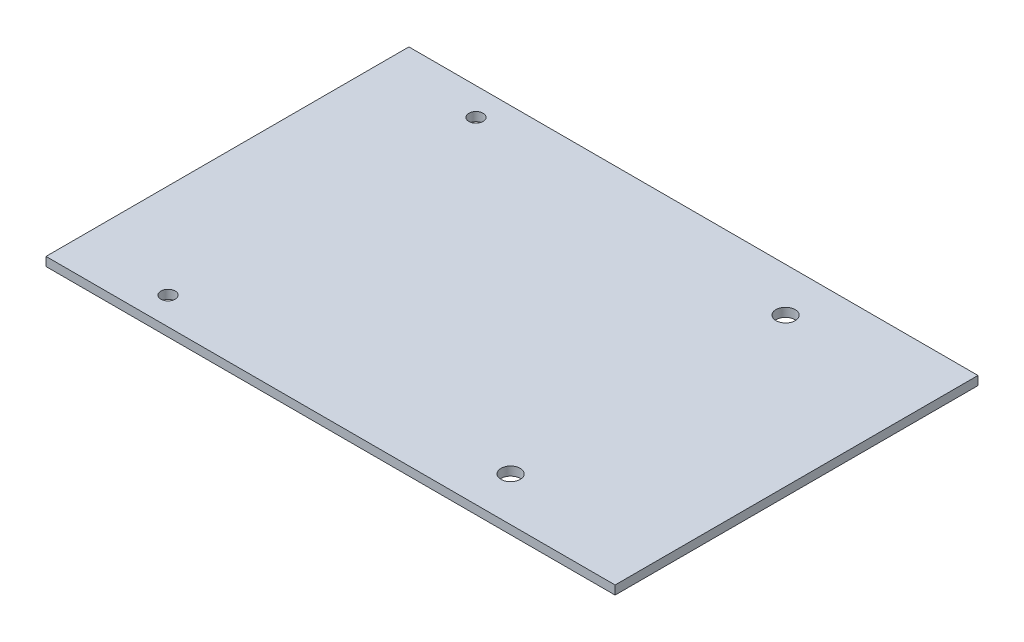
ISO-10303-21;
HEADER;
FILE_DESCRIPTION(('STEP AP214'),'2;1');
FILE_NAME('part.step','',(''),(''),'','','');
FILE_SCHEMA(('AUTOMOTIVE_DESIGN { 1 0 10303 214 1 1 1 1 }'));
ENDSEC;
DATA;
#1=APPLICATION_CONTEXT('core data for automotive mechanical design processes');
#2=APPLICATION_PROTOCOL_DEFINITION('international standard','automotive_design',2000,#1);
#3=PRODUCT_CONTEXT('',#1,'mechanical');
#4=PRODUCT('Part','Part','',(#3));
#5=PRODUCT_RELATED_PRODUCT_CATEGORY('part','',(#4));
#6=PRODUCT_DEFINITION_FORMATION('','',#4);
#7=PRODUCT_DEFINITION_CONTEXT('part definition',#1,'design');
#8=PRODUCT_DEFINITION('design','',#6,#7);
#9=PRODUCT_DEFINITION_SHAPE('','',#8);
#10=(LENGTH_UNIT() NAMED_UNIT(*) SI_UNIT(.MILLI.,.METRE.));
#11=(NAMED_UNIT(*) PLANE_ANGLE_UNIT() SI_UNIT($,.RADIAN.));
#12=(NAMED_UNIT(*) SI_UNIT($,.STERADIAN.) SOLID_ANGLE_UNIT());
#13=UNCERTAINTY_MEASURE_WITH_UNIT(LENGTH_MEASURE(1.E-05),#10,'distance_accuracy_value','');
#14=(GEOMETRIC_REPRESENTATION_CONTEXT(3) GLOBAL_UNCERTAINTY_ASSIGNED_CONTEXT((#13)) GLOBAL_UNIT_ASSIGNED_CONTEXT((#10,
#11,#12)) REPRESENTATION_CONTEXT('',''));
#15=CARTESIAN_POINT('',(0.,0.,0.));
#16=DIRECTION('',(0.,0.,1.));
#17=DIRECTION('',(1.,0.,0.));
#18=AXIS2_PLACEMENT_3D('',#15,#16,#17);
#19=CARTESIAN_POINT('',(51.75,1.6,33.));
#20=DIRECTION('',(-1.,0.,0.));
#21=DIRECTION('',(0.,0.,1.));
#22=AXIS2_PLACEMENT_3D('',#19,#20,#21);
#23=PLANE('',#22);
#24=DIRECTION('',(0.,0.,-1.));
#25=VECTOR('',#24,1.);
#26=CARTESIAN_POINT('',(51.75,0.,33.));
#27=LINE('',#26,#25);
#28=CARTESIAN_POINT('',(51.75,0.,33.));
#29=VERTEX_POINT('',#28);
#30=CARTESIAN_POINT('',(51.75,0.,-33.));
#31=VERTEX_POINT('',#30);
#32=EDGE_CURVE('E97',#29,#31,#27,.T.);
#33=ORIENTED_EDGE('',*,*,#32,.T.);
#34=DIRECTION('',(0.,-1.,0.));
#35=VECTOR('',#34,1.);
#36=CARTESIAN_POINT('',(51.75,1.6,-33.));
#37=LINE('',#36,#35);
#38=CARTESIAN_POINT('',(51.75,1.6,-33.));
#39=VERTEX_POINT('',#38);
#40=EDGE_CURVE('E11',#39,#31,#37,.T.);
#41=ORIENTED_EDGE('',*,*,#40,.F.);
#42=DIRECTION('',(0.,0.,-1.));
#43=VECTOR('',#42,1.);
#44=CARTESIAN_POINT('',(51.75,1.6,33.));
#45=LINE('',#44,#43);
#46=CARTESIAN_POINT('',(51.75,1.6,33.));
#47=VERTEX_POINT('',#46);
#48=EDGE_CURVE('E84',#47,#39,#45,.T.);
#49=ORIENTED_EDGE('',*,*,#48,.F.);
#50=DIRECTION('',(0.,-1.,0.));
#51=VECTOR('',#50,1.);
#52=CARTESIAN_POINT('',(51.75,1.6,33.));
#53=LINE('',#52,#51);
#54=EDGE_CURVE('E93',#47,#29,#53,.T.);
#55=ORIENTED_EDGE('',*,*,#54,.T.);
#56=EDGE_LOOP('',(#33,#41,#49,#55));
#57=FACE_BOUND('',#56,.T.);
#58=ADVANCED_FACE('F31',(#57),#23,.F.);
#59=CARTESIAN_POINT('',(-51.75,1.6,-33.));
#60=DIRECTION('',(0.,0.,1.));
#61=DIRECTION('',(1.,0.,0.));
#62=AXIS2_PLACEMENT_3D('',#59,#60,#61);
#63=PLANE('',#62);
#64=DIRECTION('',(-1.,0.,0.));
#65=VECTOR('',#64,1.);
#66=CARTESIAN_POINT('',(-51.75,0.,-33.));
#67=LINE('',#66,#65);
#68=CARTESIAN_POINT('',(-51.75,0.,-33.));
#69=VERTEX_POINT('',#68);
#70=EDGE_CURVE('E88',#31,#69,#67,.T.);
#71=ORIENTED_EDGE('',*,*,#70,.T.);
#72=DIRECTION('',(0.,-1.,0.));
#73=VECTOR('',#72,1.);
#74=CARTESIAN_POINT('',(-51.75,1.6,-33.));
#75=LINE('',#74,#73);
#76=CARTESIAN_POINT('',(-51.75,1.6,-33.));
#77=VERTEX_POINT('',#76);
#78=EDGE_CURVE('E40',#77,#69,#75,.T.);
#79=ORIENTED_EDGE('',*,*,#78,.F.);
#80=DIRECTION('',(-1.,0.,0.));
#81=VECTOR('',#80,1.);
#82=CARTESIAN_POINT('',(-51.75,1.6,-33.));
#83=LINE('',#82,#81);
#84=EDGE_CURVE('E79',#39,#77,#83,.T.);
#85=ORIENTED_EDGE('',*,*,#84,.F.);
#86=ORIENTED_EDGE('',*,*,#40,.T.);
#87=EDGE_LOOP('',(#71,#79,#85,#86));
#88=FACE_BOUND('',#87,.T.);
#89=ADVANCED_FACE('F87',(#88),#63,.F.);
#90=CARTESIAN_POINT('',(-51.75,1.6,33.));
#91=DIRECTION('',(1.,0.,0.));
#92=DIRECTION('',(0.,0.,-1.));
#93=AXIS2_PLACEMENT_3D('',#90,#91,#92);
#94=PLANE('',#93);
#95=DIRECTION('',(0.,0.,1.));
#96=VECTOR('',#95,1.);
#97=CARTESIAN_POINT('',(-51.75,0.,33.));
#98=LINE('',#97,#96);
#99=CARTESIAN_POINT('',(-51.75,0.,33.));
#100=VERTEX_POINT('',#99);
#101=EDGE_CURVE('E66',#69,#100,#98,.T.);
#102=ORIENTED_EDGE('',*,*,#101,.T.);
#103=DIRECTION('',(0.,-1.,0.));
#104=VECTOR('',#103,1.);
#105=CARTESIAN_POINT('',(-51.75,1.6,33.));
#106=LINE('',#105,#104);
#107=CARTESIAN_POINT('',(-51.75,1.6,33.));
#108=VERTEX_POINT('',#107);
#109=EDGE_CURVE('E89',#108,#100,#106,.T.);
#110=ORIENTED_EDGE('',*,*,#109,.F.);
#111=DIRECTION('',(0.,0.,1.));
#112=VECTOR('',#111,1.);
#113=CARTESIAN_POINT('',(-51.75,1.6,33.));
#114=LINE('',#113,#112);
#115=EDGE_CURVE('E82',#77,#108,#114,.T.);
#116=ORIENTED_EDGE('',*,*,#115,.F.);
#117=ORIENTED_EDGE('',*,*,#78,.T.);
#118=EDGE_LOOP('',(#102,#110,#116,#117));
#119=FACE_BOUND('',#118,.T.);
#120=ADVANCED_FACE('F91',(#119),#94,.F.);
#121=CARTESIAN_POINT('',(-51.75,1.6,33.));
#122=DIRECTION('',(0.,0.,-1.));
#123=DIRECTION('',(-1.,0.,0.));
#124=AXIS2_PLACEMENT_3D('',#121,#122,#123);
#125=PLANE('',#124);
#126=DIRECTION('',(1.,0.,0.));
#127=VECTOR('',#126,1.);
#128=CARTESIAN_POINT('',(-51.75,0.,33.));
#129=LINE('',#128,#127);
#130=EDGE_CURVE('E72',#100,#29,#129,.T.);
#131=ORIENTED_EDGE('',*,*,#130,.T.);
#132=ORIENTED_EDGE('',*,*,#54,.F.);
#133=DIRECTION('',(1.,0.,0.));
#134=VECTOR('',#133,1.);
#135=CARTESIAN_POINT('',(-51.75,1.6,33.));
#136=LINE('',#135,#134);
#137=EDGE_CURVE('E49',#108,#47,#136,.T.);
#138=ORIENTED_EDGE('',*,*,#137,.F.);
#139=ORIENTED_EDGE('',*,*,#109,.T.);
#140=EDGE_LOOP('',(#131,#132,#138,#139));
#141=FACE_BOUND('',#140,.T.);
#142=ADVANCED_FACE('F136',(#141),#125,.F.);
#143=CARTESIAN_POINT('',(51.75,1.6,-33.));
#144=DIRECTION('',(0.,-1.,0.));
#145=DIRECTION('',(0.,0.,-1.));
#146=AXIS2_PLACEMENT_3D('',#143,#144,#145);
#147=PLANE('',#146);
#148=CARTESIAN_POINT('',(24.75,1.6,25.));
#149=DIRECTION('',(0.,1.,0.));
#150=DIRECTION('',(0.,0.,1.));
#151=AXIS2_PLACEMENT_3D('',#148,#149,#150);
#152=CIRCLE('',#151,1.75);
#153=CARTESIAN_POINT('',(24.75,1.6,26.75));
#154=VERTEX_POINT('',#153);
#155=EDGE_CURVE('E122',#154,#154,#152,.T.);
#156=ORIENTED_EDGE('',*,*,#155,.F.);
#157=EDGE_LOOP('',(#156));
#158=FACE_BOUND('',#157,.T.);
#159=CARTESIAN_POINT('',(24.75,1.6,-25.));
#160=DIRECTION('',(0.,1.,0.));
#161=DIRECTION('',(0.,0.,1.));
#162=AXIS2_PLACEMENT_3D('',#159,#160,#161);
#163=CIRCLE('',#162,1.75);
#164=CARTESIAN_POINT('',(24.75,1.6,-23.25));
#165=VERTEX_POINT('',#164);
#166=EDGE_CURVE('E118',#165,#165,#163,.T.);
#167=ORIENTED_EDGE('',*,*,#166,.F.);
#168=EDGE_LOOP('',(#167));
#169=FACE_BOUND('',#168,.T.);
#170=CARTESIAN_POINT('',(-34.552335,1.6,28.));
#171=DIRECTION('',(0.,1.,0.));
#172=DIRECTION('',(0.,0.,1.));
#173=AXIS2_PLACEMENT_3D('',#170,#171,#172);
#174=CIRCLE('',#173,1.3);
#175=CARTESIAN_POINT('',(-34.552335,1.6,29.3));
#176=VERTEX_POINT('',#175);
#177=EDGE_CURVE('E114',#176,#176,#174,.T.);
#178=ORIENTED_EDGE('',*,*,#177,.F.);
#179=EDGE_LOOP('',(#178));
#180=FACE_BOUND('',#179,.T.);
#181=CARTESIAN_POINT('',(-34.552335,1.6,-28.));
#182=DIRECTION('',(0.,1.,0.));
#183=DIRECTION('',(0.,0.,1.));
#184=AXIS2_PLACEMENT_3D('',#181,#182,#183);
#185=CIRCLE('',#184,1.3);
#186=CARTESIAN_POINT('',(-34.552335,1.6,-26.7));
#187=VERTEX_POINT('',#186);
#188=EDGE_CURVE('E106',#187,#187,#185,.T.);
#189=ORIENTED_EDGE('',*,*,#188,.F.);
#190=EDGE_LOOP('',(#189));
#191=FACE_BOUND('',#190,.T.);
#192=ORIENTED_EDGE('',*,*,#48,.T.);
#193=ORIENTED_EDGE('',*,*,#84,.T.);
#194=ORIENTED_EDGE('',*,*,#115,.T.);
#195=ORIENTED_EDGE('',*,*,#137,.T.);
#196=EDGE_LOOP('',(#192,#193,#194,#195));
#197=FACE_BOUND('',#196,.T.);
#198=ADVANCED_FACE('F80',(#158,#169,#180,#191,#197),#147,.F.);
#199=CARTESIAN_POINT('',(51.75,0.,-33.));
#200=DIRECTION('',(0.,-1.,0.));
#201=DIRECTION('',(0.,0.,-1.));
#202=AXIS2_PLACEMENT_3D('',#199,#200,#201);
#203=PLANE('',#202);
#204=CARTESIAN_POINT('',(24.75,0.,25.));
#205=DIRECTION('',(0.,-1.,0.));
#206=DIRECTION('',(0.,0.,-1.));
#207=AXIS2_PLACEMENT_3D('',#204,#205,#206);
#208=CIRCLE('',#207,1.75);
#209=CARTESIAN_POINT('',(24.75,0.,23.25));
#210=VERTEX_POINT('',#209);
#211=EDGE_CURVE('E125',#210,#210,#208,.F.);
#212=ORIENTED_EDGE('',*,*,#211,.T.);
#213=EDGE_LOOP('',(#212));
#214=FACE_BOUND('',#213,.T.);
#215=CARTESIAN_POINT('',(24.75,0.,-25.));
#216=DIRECTION('',(0.,-1.,0.));
#217=DIRECTION('',(0.,0.,-1.));
#218=AXIS2_PLACEMENT_3D('',#215,#216,#217);
#219=CIRCLE('',#218,1.75);
#220=CARTESIAN_POINT('',(24.75,0.,-26.75));
#221=VERTEX_POINT('',#220);
#222=EDGE_CURVE('E119',#221,#221,#219,.F.);
#223=ORIENTED_EDGE('',*,*,#222,.T.);
#224=EDGE_LOOP('',(#223));
#225=FACE_BOUND('',#224,.T.);
#226=CARTESIAN_POINT('',(-34.552335,0.,28.));
#227=DIRECTION('',(0.,-1.,0.));
#228=DIRECTION('',(0.,0.,-1.));
#229=AXIS2_PLACEMENT_3D('',#226,#227,#228);
#230=CIRCLE('',#229,1.3);
#231=CARTESIAN_POINT('',(-34.552335,0.,26.7));
#232=VERTEX_POINT('',#231);
#233=EDGE_CURVE('E34',#232,#232,#230,.T.);
#234=ORIENTED_EDGE('',*,*,#233,.F.);
#235=EDGE_LOOP('',(#234));
#236=FACE_BOUND('',#235,.T.);
#237=CARTESIAN_POINT('',(-34.552335,0.,-28.));
#238=DIRECTION('',(0.,-1.,0.));
#239=DIRECTION('',(0.,0.,-1.));
#240=AXIS2_PLACEMENT_3D('',#237,#238,#239);
#241=CIRCLE('',#240,1.3);
#242=CARTESIAN_POINT('',(-34.552335,0.,-29.3));
#243=VERTEX_POINT('',#242);
#244=EDGE_CURVE('E100',#243,#243,#241,.T.);
#245=ORIENTED_EDGE('',*,*,#244,.F.);
#246=EDGE_LOOP('',(#245));
#247=FACE_BOUND('',#246,.T.);
#248=ORIENTED_EDGE('',*,*,#32,.F.);
#249=ORIENTED_EDGE('',*,*,#130,.F.);
#250=ORIENTED_EDGE('',*,*,#101,.F.);
#251=ORIENTED_EDGE('',*,*,#70,.F.);
#252=EDGE_LOOP('',(#248,#249,#250,#251));
#253=FACE_BOUND('',#252,.T.);
#254=ADVANCED_FACE('F135',(#214,#225,#236,#247,#253),#203,.T.);
#255=CARTESIAN_POINT('',(-34.552335,-8.4,-28.));
#256=DIRECTION('',(0.,1.,0.));
#257=DIRECTION('',(0.,0.,1.));
#258=AXIS2_PLACEMENT_3D('',#255,#256,#257);
#259=CYLINDRICAL_SURFACE('',#258,1.3);
#260=ORIENTED_EDGE('',*,*,#244,.T.);
#261=EDGE_LOOP('',(#260));
#262=FACE_BOUND('',#261,.T.);
#263=ORIENTED_EDGE('',*,*,#188,.T.);
#264=EDGE_LOOP('',(#263));
#265=FACE_BOUND('',#264,.T.);
#266=ADVANCED_FACE('F146',(#262,#265),#259,.F.);
#267=CARTESIAN_POINT('',(-34.552335,-8.4,28.));
#268=DIRECTION('',(0.,1.,0.));
#269=DIRECTION('',(0.,0.,1.));
#270=AXIS2_PLACEMENT_3D('',#267,#268,#269);
#271=CYLINDRICAL_SURFACE('',#270,1.3);
#272=ORIENTED_EDGE('',*,*,#233,.T.);
#273=EDGE_LOOP('',(#272));
#274=FACE_BOUND('',#273,.T.);
#275=ORIENTED_EDGE('',*,*,#177,.T.);
#276=EDGE_LOOP('',(#275));
#277=FACE_BOUND('',#276,.T.);
#278=ADVANCED_FACE('F143',(#274,#277),#271,.F.);
#279=CARTESIAN_POINT('',(24.75,-0.000999999999999916,-25.));
#280=DIRECTION('',(0.,1.,0.));
#281=DIRECTION('',(0.,0.,1.));
#282=AXIS2_PLACEMENT_3D('',#279,#280,#281);
#283=CYLINDRICAL_SURFACE('',#282,1.75);
#284=ORIENTED_EDGE('',*,*,#222,.F.);
#285=EDGE_LOOP('',(#284));
#286=FACE_BOUND('',#285,.T.);
#287=ORIENTED_EDGE('',*,*,#166,.T.);
#288=EDGE_LOOP('',(#287));
#289=FACE_BOUND('',#288,.T.);
#290=ADVANCED_FACE('F145',(#286,#289),#283,.F.);
#291=CARTESIAN_POINT('',(24.75,-0.000999999999999916,25.));
#292=DIRECTION('',(0.,1.,0.));
#293=DIRECTION('',(0.,0.,1.));
#294=AXIS2_PLACEMENT_3D('',#291,#292,#293);
#295=CYLINDRICAL_SURFACE('',#294,1.75);
#296=ORIENTED_EDGE('',*,*,#211,.F.);
#297=EDGE_LOOP('',(#296));
#298=FACE_BOUND('',#297,.T.);
#299=ORIENTED_EDGE('',*,*,#155,.T.);
#300=EDGE_LOOP('',(#299));
#301=FACE_BOUND('',#300,.T.);
#302=ADVANCED_FACE('F131',(#298,#301),#295,.F.);
#303=CLOSED_SHELL('',(#58,#89,#120,#142,#198,#254,#266,#278,#290,#302));
#304=MANIFOLD_SOLID_BREP('B2',#303);
#305=ADVANCED_BREP_SHAPE_REPRESENTATION('',(#18,#304),#14);
#306=SHAPE_DEFINITION_REPRESENTATION(#9,#305);
ENDSEC;
END-ISO-10303-21;
